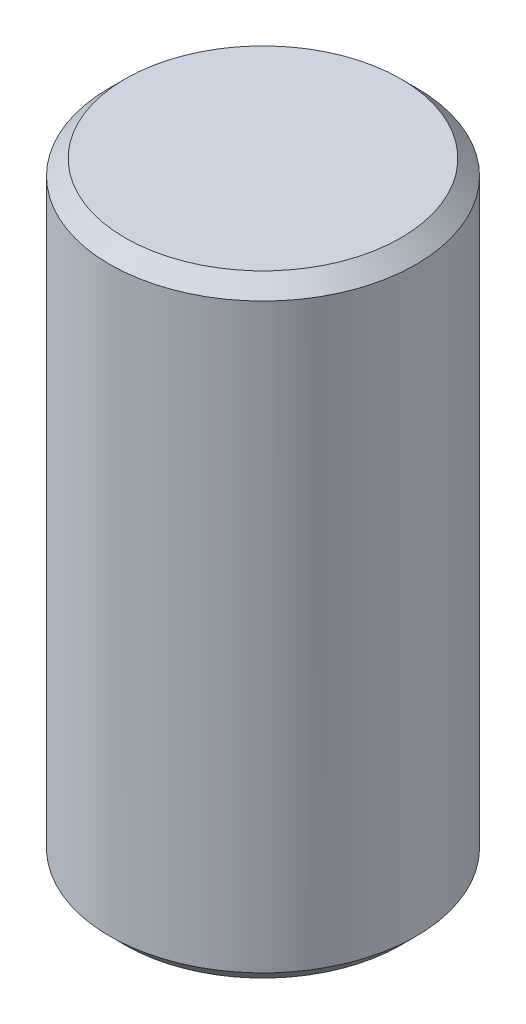
ISO-10303-21;
HEADER;
FILE_DESCRIPTION(('STEP AP214'),'2;1');
FILE_NAME('part.step','',(''),(''),'','','');
FILE_SCHEMA(('AUTOMOTIVE_DESIGN { 1 0 10303 214 1 1 1 1 }'));
ENDSEC;
DATA;
#1=APPLICATION_CONTEXT('core data for automotive mechanical design processes');
#2=APPLICATION_PROTOCOL_DEFINITION('international standard','automotive_design',2000,#1);
#3=PRODUCT_CONTEXT('',#1,'mechanical');
#4=PRODUCT('Part','Part','',(#3));
#5=PRODUCT_RELATED_PRODUCT_CATEGORY('part','',(#4));
#6=PRODUCT_DEFINITION_FORMATION('','',#4);
#7=PRODUCT_DEFINITION_CONTEXT('part definition',#1,'design');
#8=PRODUCT_DEFINITION('design','',#6,#7);
#9=PRODUCT_DEFINITION_SHAPE('','',#8);
#10=(LENGTH_UNIT() NAMED_UNIT(*) SI_UNIT(.MILLI.,.METRE.));
#11=(NAMED_UNIT(*) PLANE_ANGLE_UNIT() SI_UNIT($,.RADIAN.));
#12=(NAMED_UNIT(*) SI_UNIT($,.STERADIAN.) SOLID_ANGLE_UNIT());
#13=UNCERTAINTY_MEASURE_WITH_UNIT(LENGTH_MEASURE(1.E-05),#10,'distance_accuracy_value','');
#14=(GEOMETRIC_REPRESENTATION_CONTEXT(3) GLOBAL_UNCERTAINTY_ASSIGNED_CONTEXT((#13)) GLOBAL_UNIT_ASSIGNED_CONTEXT((#10,
#11,#12)) REPRESENTATION_CONTEXT('',''));
#15=CARTESIAN_POINT('',(0.,0.,0.));
#16=DIRECTION('',(0.,0.,1.));
#17=DIRECTION('',(1.,0.,0.));
#18=AXIS2_PLACEMENT_3D('',#15,#16,#17);
#19=CARTESIAN_POINT('',(0.,20.,0.));
#20=DIRECTION('',(0.,1.,0.));
#21=DIRECTION('',(0.,0.,1.));
#22=AXIS2_PLACEMENT_3D('',#19,#20,#21);
#23=PLANE('',#22);
#24=CARTESIAN_POINT('',(0.,20.,0.));
#25=DIRECTION('',(0.,1.,0.));
#26=DIRECTION('',(0.,0.,1.));
#27=AXIS2_PLACEMENT_3D('',#24,#25,#26);
#28=CIRCLE('',#27,4.5);
#29=CARTESIAN_POINT('',(0.,20.,4.5));
#30=VERTEX_POINT('',#29);
#31=EDGE_CURVE('E10',#30,#30,#28,.T.);
#32=ORIENTED_EDGE('',*,*,#31,.T.);
#33=EDGE_LOOP('',(#32));
#34=FACE_BOUND('',#33,.T.);
#35=ADVANCED_FACE('F39',(#34),#23,.T.);
#36=CARTESIAN_POINT('',(0.,0.,0.));
#37=DIRECTION('',(0.,-1.,0.));
#38=DIRECTION('',(0.,0.,-1.));
#39=AXIS2_PLACEMENT_3D('',#36,#37,#38);
#40=CYLINDRICAL_SURFACE('',#39,5.);
#41=CARTESIAN_POINT('',(0.,0.499999999999999,0.));
#42=DIRECTION('',(0.,-1.,0.));
#43=DIRECTION('',(0.,0.,-1.));
#44=AXIS2_PLACEMENT_3D('',#41,#42,#43);
#45=CIRCLE('',#44,5.);
#46=CARTESIAN_POINT('',(0.,0.499999999999999,-5.));
#47=VERTEX_POINT('',#46);
#48=EDGE_CURVE('E47',#47,#47,#45,.F.);
#49=ORIENTED_EDGE('',*,*,#48,.T.);
#50=EDGE_LOOP('',(#49));
#51=FACE_BOUND('',#50,.T.);
#52=CARTESIAN_POINT('',(0.,19.5,0.));
#53=DIRECTION('',(0.,1.,0.));
#54=DIRECTION('',(0.,0.,1.));
#55=AXIS2_PLACEMENT_3D('',#52,#53,#54);
#56=CIRCLE('',#55,5.);
#57=CARTESIAN_POINT('',(0.,19.5,5.));
#58=VERTEX_POINT('',#57);
#59=EDGE_CURVE('E51',#58,#58,#56,.F.);
#60=ORIENTED_EDGE('',*,*,#59,.T.);
#61=EDGE_LOOP('',(#60));
#62=FACE_BOUND('',#61,.T.);
#63=ADVANCED_FACE('F71',(#51,#62),#40,.T.);
#64=CARTESIAN_POINT('',(0.,0.,0.));
#65=DIRECTION('',(0.,-1.,0.));
#66=DIRECTION('',(0.,0.,-1.));
#67=AXIS2_PLACEMENT_3D('',#64,#65,#66);
#68=PLANE('',#67);
#69=CARTESIAN_POINT('',(0.,0.,0.));
#70=DIRECTION('',(0.,-1.,0.));
#71=DIRECTION('',(0.,0.,-1.));
#72=AXIS2_PLACEMENT_3D('',#69,#70,#71);
#73=CIRCLE('',#72,4.5);
#74=CARTESIAN_POINT('',(0.,0.,-4.5));
#75=VERTEX_POINT('',#74);
#76=EDGE_CURVE('E55',#75,#75,#73,.T.);
#77=ORIENTED_EDGE('',*,*,#76,.T.);
#78=EDGE_LOOP('',(#77));
#79=FACE_BOUND('',#78,.T.);
#80=ADVANCED_FACE('F61',(#79),#68,.T.);
#81=CARTESIAN_POINT('',(0.,0.,0.));
#82=DIRECTION('',(0.,1.,0.));
#83=DIRECTION('',(0.,0.,1.));
#84=AXIS2_PLACEMENT_3D('',#81,#82,#83);
#85=CONICAL_SURFACE('',#84,4.5,0.785398163397445);
#86=ORIENTED_EDGE('',*,*,#48,.F.);
#87=EDGE_LOOP('',(#86));
#88=FACE_BOUND('',#87,.T.);
#89=ORIENTED_EDGE('',*,*,#76,.F.);
#90=EDGE_LOOP('',(#89));
#91=FACE_BOUND('',#90,.T.);
#92=ADVANCED_FACE('F63',(#88,#91),#85,.T.);
#93=CARTESIAN_POINT('',(0.,19.5,0.));
#94=DIRECTION('',(0.,-1.,0.));
#95=DIRECTION('',(0.,0.,-1.));
#96=AXIS2_PLACEMENT_3D('',#93,#94,#95);
#97=CONICAL_SURFACE('',#96,5.,0.785398163397452);
#98=ORIENTED_EDGE('',*,*,#31,.F.);
#99=EDGE_LOOP('',(#98));
#100=FACE_BOUND('',#99,.T.);
#101=ORIENTED_EDGE('',*,*,#59,.F.);
#102=EDGE_LOOP('',(#101));
#103=FACE_BOUND('',#102,.T.);
#104=ADVANCED_FACE('F42',(#100,#103),#97,.T.);
#105=CLOSED_SHELL('',(#35,#63,#80,#92,#104));
#106=MANIFOLD_SOLID_BREP('B2',#105);
#107=ADVANCED_BREP_SHAPE_REPRESENTATION('',(#18,#106),#14);
#108=SHAPE_DEFINITION_REPRESENTATION(#9,#107);
ENDSEC;
END-ISO-10303-21;
